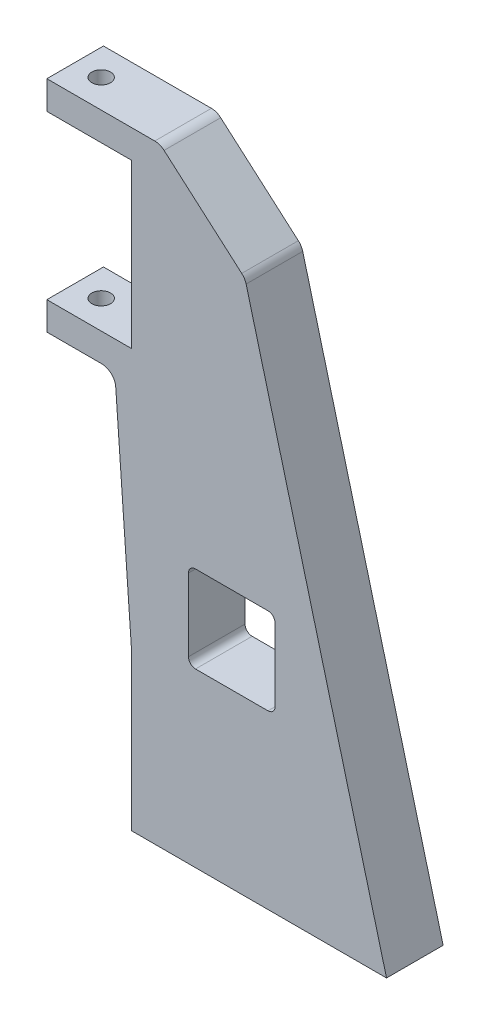
ISO-10303-21;
HEADER;
FILE_DESCRIPTION(('STEP AP214'),'2;1');
FILE_NAME('part.step','',(''),(''),'','','');
FILE_SCHEMA(('AUTOMOTIVE_DESIGN { 1 0 10303 214 1 1 1 1 }'));
ENDSEC;
DATA;
#1=APPLICATION_CONTEXT('core data for automotive mechanical design processes');
#2=APPLICATION_PROTOCOL_DEFINITION('international standard','automotive_design',2000,#1);
#3=PRODUCT_CONTEXT('',#1,'mechanical');
#4=PRODUCT('Part','Part','',(#3));
#5=PRODUCT_RELATED_PRODUCT_CATEGORY('part','',(#4));
#6=PRODUCT_DEFINITION_FORMATION('','',#4);
#7=PRODUCT_DEFINITION_CONTEXT('part definition',#1,'design');
#8=PRODUCT_DEFINITION('design','',#6,#7);
#9=PRODUCT_DEFINITION_SHAPE('','',#8);
#10=(LENGTH_UNIT() NAMED_UNIT(*) SI_UNIT(.MILLI.,.METRE.));
#11=(NAMED_UNIT(*) PLANE_ANGLE_UNIT() SI_UNIT($,.RADIAN.));
#12=(NAMED_UNIT(*) SI_UNIT($,.STERADIAN.) SOLID_ANGLE_UNIT());
#13=UNCERTAINTY_MEASURE_WITH_UNIT(LENGTH_MEASURE(1.E-05),#10,'distance_accuracy_value','');
#14=(GEOMETRIC_REPRESENTATION_CONTEXT(3) GLOBAL_UNCERTAINTY_ASSIGNED_CONTEXT((#13)) GLOBAL_UNIT_ASSIGNED_CONTEXT((#10,
#11,#12)) REPRESENTATION_CONTEXT('',''));
#15=CARTESIAN_POINT('',(0.,0.,0.));
#16=DIRECTION('',(0.,0.,1.));
#17=DIRECTION('',(1.,0.,0.));
#18=AXIS2_PLACEMENT_3D('',#15,#16,#17);
#19=CARTESIAN_POINT('',(0.,0.,25.4));
#20=DIRECTION('',(0.,1.,0.));
#21=DIRECTION('',(0.,0.,1.));
#22=AXIS2_PLACEMENT_3D('',#19,#20,#21);
#23=PLANE('',#22);
#24=CARTESIAN_POINT('',(11.684,0.,12.7));
#25=DIRECTION('',(0.,1.,0.));
#26=DIRECTION('',(0.,0.,1.));
#27=AXIS2_PLACEMENT_3D('',#24,#25,#26);
#28=CIRCLE('',#27,4.191);
#29=CARTESIAN_POINT('',(11.684,0.,16.891));
#30=VERTEX_POINT('',#29);
#31=EDGE_CURVE('E347',#30,#30,#28,.T.);
#32=ORIENTED_EDGE('',*,*,#31,.T.);
#33=EDGE_LOOP('',(#32));
#34=FACE_BOUND('',#33,.T.);
#35=DIRECTION('',(1.,0.,0.));
#36=VECTOR('',#35,1.);
#37=CARTESIAN_POINT('',(0.,0.,0.));
#38=LINE('',#37,#36);
#39=CARTESIAN_POINT('',(0.,0.,0.));
#40=VERTEX_POINT('',#39);
#41=CARTESIAN_POINT('',(38.0186594192209,0.,0.));
#42=VERTEX_POINT('',#41);
#43=EDGE_CURVE('E226',#40,#42,#38,.T.);
#44=ORIENTED_EDGE('',*,*,#43,.T.);
#45=DIRECTION('',(0.,0.,-1.));
#46=VECTOR('',#45,1.);
#47=CARTESIAN_POINT('',(38.0186594192209,0.,25.4));
#48=LINE('',#47,#46);
#49=CARTESIAN_POINT('',(38.0186594192209,0.,25.4));
#50=VERTEX_POINT('',#49);
#51=EDGE_CURVE('E204',#50,#42,#48,.T.);
#52=ORIENTED_EDGE('',*,*,#51,.F.);
#53=DIRECTION('',(1.,0.,0.));
#54=VECTOR('',#53,1.);
#55=CARTESIAN_POINT('',(0.,0.,25.4));
#56=LINE('',#55,#54);
#57=CARTESIAN_POINT('',(0.,0.,25.4));
#58=VERTEX_POINT('',#57);
#59=EDGE_CURVE('E212',#58,#50,#56,.T.);
#60=ORIENTED_EDGE('',*,*,#59,.F.);
#61=DIRECTION('',(0.,0.,-1.));
#62=VECTOR('',#61,1.);
#63=CARTESIAN_POINT('',(0.,0.,25.4));
#64=LINE('',#63,#62);
#65=EDGE_CURVE('E408',#58,#40,#64,.T.);
#66=ORIENTED_EDGE('',*,*,#65,.T.);
#67=EDGE_LOOP('',(#44,#52,#60,#66));
#68=FACE_BOUND('',#67,.T.);
#69=ADVANCED_FACE('F38',(#34,#68),#23,.F.);
#70=CARTESIAN_POINT('',(38.0186594192209,0.,25.4));
#71=DIRECTION('',(1.,0.,0.));
#72=DIRECTION('',(0.,0.,-1.));
#73=AXIS2_PLACEMENT_3D('',#70,#71,#72);
#74=PLANE('',#73);
#75=DIRECTION('',(0.,-1.,0.));
#76=VECTOR('',#75,1.);
#77=CARTESIAN_POINT('',(38.0186594192209,0.,0.));
#78=LINE('',#77,#76);
#79=CARTESIAN_POINT('',(38.0186594192209,-73.1522603664943,0.));
#80=VERTEX_POINT('',#79);
#81=EDGE_CURVE('E411',#42,#80,#78,.T.);
#82=ORIENTED_EDGE('',*,*,#81,.T.);
#83=DIRECTION('',(0.,0.,-1.));
#84=VECTOR('',#83,1.);
#85=CARTESIAN_POINT('',(38.0186594192209,-73.1522603664943,25.4));
#86=LINE('',#85,#84);
#87=CARTESIAN_POINT('',(38.0186594192209,-73.1522603664943,25.4));
#88=VERTEX_POINT('',#87);
#89=EDGE_CURVE('E207',#88,#80,#86,.T.);
#90=ORIENTED_EDGE('',*,*,#89,.F.);
#91=DIRECTION('',(0.,-1.,0.));
#92=VECTOR('',#91,1.);
#93=CARTESIAN_POINT('',(38.0186594192209,0.,25.4));
#94=LINE('',#93,#92);
#95=EDGE_CURVE('E200',#50,#88,#94,.T.);
#96=ORIENTED_EDGE('',*,*,#95,.F.);
#97=ORIENTED_EDGE('',*,*,#51,.T.);
#98=EDGE_LOOP('',(#82,#90,#96,#97));
#99=FACE_BOUND('',#98,.T.);
#100=ADVANCED_FACE('F202',(#99),#74,.F.);
#101=CARTESIAN_POINT('',(38.0186594192209,-73.1522603664943,25.4));
#102=DIRECTION('',(0.,-1.,0.));
#103=DIRECTION('',(0.,0.,-1.));
#104=AXIS2_PLACEMENT_3D('',#101,#102,#103);
#105=PLANE('',#104);
#106=CARTESIAN_POINT('',(11.684,-73.1522603664942,12.7));
#107=DIRECTION('',(0.,-1.,0.));
#108=DIRECTION('',(0.,0.,-1.));
#109=AXIS2_PLACEMENT_3D('',#106,#107,#108);
#110=CIRCLE('',#109,4.191);
#111=CARTESIAN_POINT('',(11.684,-73.1522603664942,8.509));
#112=VERTEX_POINT('',#111);
#113=EDGE_CURVE('E625',#112,#112,#110,.T.);
#114=ORIENTED_EDGE('',*,*,#113,.T.);
#115=EDGE_LOOP('',(#114));
#116=FACE_BOUND('',#115,.T.);
#117=DIRECTION('',(-1.,0.,0.));
#118=VECTOR('',#117,1.);
#119=CARTESIAN_POINT('',(38.0186594192209,-73.1522603664943,0.));
#120=LINE('',#119,#118);
#121=CARTESIAN_POINT('',(0.,-73.1522603664943,0.));
#122=VERTEX_POINT('',#121);
#123=EDGE_CURVE('E414',#80,#122,#120,.T.);
#124=ORIENTED_EDGE('',*,*,#123,.T.);
#125=DIRECTION('',(0.,0.,-1.));
#126=VECTOR('',#125,1.);
#127=CARTESIAN_POINT('',(0.,-73.1522603664943,25.4));
#128=LINE('',#127,#126);
#129=CARTESIAN_POINT('',(0.,-73.1522603664943,25.4));
#130=VERTEX_POINT('',#129);
#131=EDGE_CURVE('E235',#130,#122,#128,.T.);
#132=ORIENTED_EDGE('',*,*,#131,.F.);
#133=DIRECTION('',(-1.,0.,0.));
#134=VECTOR('',#133,1.);
#135=CARTESIAN_POINT('',(38.0186594192209,-73.1522603664943,25.4));
#136=LINE('',#135,#134);
#137=EDGE_CURVE('E211',#88,#130,#136,.T.);
#138=ORIENTED_EDGE('',*,*,#137,.F.);
#139=ORIENTED_EDGE('',*,*,#89,.T.);
#140=EDGE_LOOP('',(#124,#132,#138,#139));
#141=FACE_BOUND('',#140,.T.);
#142=ADVANCED_FACE('F527',(#116,#141),#105,.F.);
#143=CARTESIAN_POINT('',(0.,-73.1522603664943,25.4));
#144=DIRECTION('',(1.,0.,0.));
#145=DIRECTION('',(0.,0.,-1.));
#146=AXIS2_PLACEMENT_3D('',#143,#144,#145);
#147=PLANE('',#146);
#148=DIRECTION('',(0.,-1.,0.));
#149=VECTOR('',#148,1.);
#150=CARTESIAN_POINT('',(0.,-73.1522603664943,0.));
#151=LINE('',#150,#149);
#152=CARTESIAN_POINT('',(0.,-85.7639267927339,0.));
#153=VERTEX_POINT('',#152);
#154=EDGE_CURVE('E417',#122,#153,#151,.T.);
#155=ORIENTED_EDGE('',*,*,#154,.T.);
#156=DIRECTION('',(0.,0.,-1.));
#157=VECTOR('',#156,1.);
#158=CARTESIAN_POINT('',(0.,-85.7639267927339,25.4));
#159=LINE('',#158,#157);
#160=CARTESIAN_POINT('',(0.,-85.7639267927339,25.4));
#161=VERTEX_POINT('',#160);
#162=EDGE_CURVE('E461',#161,#153,#159,.T.);
#163=ORIENTED_EDGE('',*,*,#162,.F.);
#164=DIRECTION('',(0.,-1.,0.));
#165=VECTOR('',#164,1.);
#166=CARTESIAN_POINT('',(0.,-73.1522603664943,25.4));
#167=LINE('',#166,#165);
#168=EDGE_CURVE('E379',#130,#161,#167,.T.);
#169=ORIENTED_EDGE('',*,*,#168,.F.);
#170=ORIENTED_EDGE('',*,*,#131,.T.);
#171=EDGE_LOOP('',(#155,#163,#169,#170));
#172=FACE_BOUND('',#171,.T.);
#173=ADVANCED_FACE('F470',(#172),#147,.F.);
#174=CARTESIAN_POINT('',(0.,-85.7639267927339,25.4));
#175=DIRECTION('',(0.,1.,0.));
#176=DIRECTION('',(0.,0.,1.));
#177=AXIS2_PLACEMENT_3D('',#174,#175,#176);
#178=PLANE('',#177);
#179=CARTESIAN_POINT('',(11.684,-85.7639267927339,12.7));
#180=DIRECTION('',(0.,1.,0.));
#181=DIRECTION('',(0.,0.,1.));
#182=AXIS2_PLACEMENT_3D('',#179,#180,#181);
#183=CIRCLE('',#182,4.191);
#184=CARTESIAN_POINT('',(11.684,-85.7639267927339,16.891));
#185=VERTEX_POINT('',#184);
#186=EDGE_CURVE('E622',#185,#185,#183,.T.);
#187=ORIENTED_EDGE('',*,*,#186,.T.);
#188=EDGE_LOOP('',(#187));
#189=FACE_BOUND('',#188,.T.);
#190=DIRECTION('',(1.,0.,0.));
#191=VECTOR('',#190,1.);
#192=CARTESIAN_POINT('',(0.,-85.7639267927339,0.));
#193=LINE('',#192,#191);
#194=CARTESIAN_POINT('',(24.5698359864801,-85.7639267927339,0.));
#195=VERTEX_POINT('',#194);
#196=EDGE_CURVE('E420',#153,#195,#193,.T.);
#197=ORIENTED_EDGE('',*,*,#196,.T.);
#198=DIRECTION('',(0.,0.,-1.));
#199=VECTOR('',#198,1.);
#200=CARTESIAN_POINT('',(24.5698359864801,-85.7639267927339,25.4));
#201=LINE('',#200,#199);
#202=CARTESIAN_POINT('',(24.5698359864801,-85.7639267927339,25.4));
#203=VERTEX_POINT('',#202);
#204=EDGE_CURVE('E245',#195,#203,#201,.F.);
#205=ORIENTED_EDGE('',*,*,#204,.T.);
#206=DIRECTION('',(1.,0.,0.));
#207=VECTOR('',#206,1.);
#208=CARTESIAN_POINT('',(0.,-85.7639267927339,25.4));
#209=LINE('',#208,#207);
#210=EDGE_CURVE('E382',#161,#203,#209,.T.);
#211=ORIENTED_EDGE('',*,*,#210,.F.);
#212=ORIENTED_EDGE('',*,*,#162,.T.);
#213=EDGE_LOOP('',(#197,#205,#211,#212));
#214=FACE_BOUND('',#213,.T.);
#215=ADVANCED_FACE('F479',(#189,#214),#178,.F.);
#216=CARTESIAN_POINT('',(30.48,-85.7639267927339,25.4));
#217=DIRECTION('',(0.997429246927339,0.071658198232729,0.));
#218=DIRECTION('',(-0.071658198232729,0.997429246927339,0.));
#219=AXIS2_PLACEMENT_3D('',#216,#217,#218);
#220=PLANE('',#219);
#221=DIRECTION('',(0.071658198232729,-0.997429246927339,0.));
#222=VECTOR('',#221,1.);
#223=CARTESIAN_POINT('',(30.48,-85.7639267927339,0.));
#224=LINE('',#223,#222);
#225=CARTESIAN_POINT('',(30.9035117044687,-91.6588972339561,0.));
#226=VERTEX_POINT('',#225);
#227=CARTESIAN_POINT('',(38.0023351372095,-190.469281603275,0.));
#228=VERTEX_POINT('',#227);
#229=EDGE_CURVE('E424',#226,#228,#224,.T.);
#230=ORIENTED_EDGE('',*,*,#229,.T.);
#231=DIRECTION('',(0.,0.,-1.));
#232=VECTOR('',#231,1.);
#233=CARTESIAN_POINT('',(38.0023351372095,-190.469281603275,25.4));
#234=LINE('',#233,#232);
#235=CARTESIAN_POINT('',(38.0023351372095,-190.469281603275,25.4));
#236=VERTEX_POINT('',#235);
#237=EDGE_CURVE('E242',#228,#236,#234,.F.);
#238=ORIENTED_EDGE('',*,*,#237,.T.);
#239=DIRECTION('',(0.071658198232729,-0.997429246927339,0.));
#240=VECTOR('',#239,1.);
#241=CARTESIAN_POINT('',(30.48,-85.7639267927339,25.4));
#242=LINE('',#241,#240);
#243=CARTESIAN_POINT('',(30.9035117044687,-91.6588972339561,25.4));
#244=VERTEX_POINT('',#243);
#245=EDGE_CURVE('E386',#244,#236,#242,.T.);
#246=ORIENTED_EDGE('',*,*,#245,.F.);
#247=DIRECTION('',(0.,0.,-1.));
#248=VECTOR('',#247,1.);
#249=CARTESIAN_POINT('',(30.9035117044687,-91.6588972339561,0.));
#250=LINE('',#249,#248);
#251=EDGE_CURVE('E233',#244,#226,#250,.T.);
#252=ORIENTED_EDGE('',*,*,#251,.T.);
#253=EDGE_LOOP('',(#230,#238,#246,#252));
#254=FACE_BOUND('',#253,.T.);
#255=ADVANCED_FACE('F488',(#254),#220,.F.);
#256=CARTESIAN_POINT('',(38.0186594192209,-190.696503564123,25.4));
#257=DIRECTION('',(1.,0.,0.));
#258=DIRECTION('',(0.,0.,-1.));
#259=AXIS2_PLACEMENT_3D('',#256,#257,#258);
#260=PLANE('',#259);
#261=DIRECTION('',(0.,-1.,0.));
#262=VECTOR('',#261,1.);
#263=CARTESIAN_POINT('',(38.0186594192209,-190.696503564123,25.4));
#264=LINE('',#263,#262);
#265=CARTESIAN_POINT('',(38.0186594192209,-190.924311162053,25.4));
#266=VERTEX_POINT('',#265);
#267=CARTESIAN_POINT('',(38.0186594192209,-260.515926792734,25.4));
#268=VERTEX_POINT('',#267);
#269=EDGE_CURVE('E390',#266,#268,#264,.T.);
#270=ORIENTED_EDGE('',*,*,#269,.F.);
#271=DIRECTION('',(0.,0.,-1.));
#272=VECTOR('',#271,1.);
#273=CARTESIAN_POINT('',(38.0186594192209,-190.924311162053,0.));
#274=LINE('',#273,#272);
#275=CARTESIAN_POINT('',(38.0186594192209,-190.924311162053,0.));
#276=VERTEX_POINT('',#275);
#277=EDGE_CURVE('E228',#266,#276,#274,.T.);
#278=ORIENTED_EDGE('',*,*,#277,.T.);
#279=DIRECTION('',(0.,-1.,0.));
#280=VECTOR('',#279,1.);
#281=CARTESIAN_POINT('',(38.0186594192209,-190.696503564123,0.));
#282=LINE('',#281,#280);
#283=CARTESIAN_POINT('',(38.0186594192209,-260.515926792734,0.));
#284=VERTEX_POINT('',#283);
#285=EDGE_CURVE('E428',#276,#284,#282,.T.);
#286=ORIENTED_EDGE('',*,*,#285,.T.);
#287=DIRECTION('',(0.,0.,-1.));
#288=VECTOR('',#287,1.);
#289=CARTESIAN_POINT('',(38.0186594192209,-260.515926792734,25.4));
#290=LINE('',#289,#288);
#291=EDGE_CURVE('E457',#268,#284,#290,.T.);
#292=ORIENTED_EDGE('',*,*,#291,.F.);
#293=EDGE_LOOP('',(#270,#278,#286,#292));
#294=FACE_BOUND('',#293,.T.);
#295=ADVANCED_FACE('F496',(#294),#260,.F.);
#296=CARTESIAN_POINT('',(38.0186594192209,-260.515926792734,25.4));
#297=DIRECTION('',(0.,1.,0.));
#298=DIRECTION('',(-1.,0.,0.));
#299=AXIS2_PLACEMENT_3D('',#296,#297,#298);
#300=PLANE('',#299);
#301=CARTESIAN_POINT('',(139.7,-260.515926792734,12.7));
#302=DIRECTION('',(0.,-1.,0.));
#303=DIRECTION('',(1.,0.,0.));
#304=AXIS2_PLACEMENT_3D('',#301,#302,#303);
#305=CIRCLE('',#304,4.191);
#306=CARTESIAN_POINT('',(143.891,-260.515926792734,12.7));
#307=VERTEX_POINT('',#306);
#308=EDGE_CURVE('E673',#307,#307,#305,.T.);
#309=ORIENTED_EDGE('',*,*,#308,.F.);
#310=EDGE_LOOP('',(#309));
#311=FACE_BOUND('',#310,.T.);
#312=CARTESIAN_POINT('',(63.5,-260.515926792734,12.7));
#313=DIRECTION('',(0.,-1.,0.));
#314=DIRECTION('',(1.,0.,0.));
#315=AXIS2_PLACEMENT_3D('',#312,#313,#314);
#316=CIRCLE('',#315,4.191);
#317=CARTESIAN_POINT('',(67.691,-260.515926792734,12.7));
#318=VERTEX_POINT('',#317);
#319=EDGE_CURVE('E682',#318,#318,#316,.T.);
#320=ORIENTED_EDGE('',*,*,#319,.F.);
#321=EDGE_LOOP('',(#320));
#322=FACE_BOUND('',#321,.T.);
#323=DIRECTION('',(1.,0.,0.));
#324=VECTOR('',#323,1.);
#325=CARTESIAN_POINT('',(38.0186594192209,-260.515926792734,0.));
#326=LINE('',#325,#324);
#327=CARTESIAN_POINT('',(152.4,-260.515926792734,0.));
#328=VERTEX_POINT('',#327);
#329=EDGE_CURVE('E431',#284,#328,#326,.T.);
#330=ORIENTED_EDGE('',*,*,#329,.T.);
#331=DIRECTION('',(0.,0.,-1.));
#332=VECTOR('',#331,1.);
#333=CARTESIAN_POINT('',(152.4,-260.515926792734,25.4));
#334=LINE('',#333,#332);
#335=CARTESIAN_POINT('',(152.4,-260.515926792734,25.4));
#336=VERTEX_POINT('',#335);
#337=EDGE_CURVE('E453',#336,#328,#334,.T.);
#338=ORIENTED_EDGE('',*,*,#337,.F.);
#339=DIRECTION('',(1.,0.,0.));
#340=VECTOR('',#339,1.);
#341=CARTESIAN_POINT('',(38.0186594192209,-260.515926792734,25.4));
#342=LINE('',#341,#340);
#343=EDGE_CURVE('E393',#268,#336,#342,.T.);
#344=ORIENTED_EDGE('',*,*,#343,.F.);
#345=ORIENTED_EDGE('',*,*,#291,.T.);
#346=EDGE_LOOP('',(#330,#338,#344,#345));
#347=FACE_BOUND('',#346,.T.);
#348=ADVANCED_FACE('F502',(#311,#322,#347),#300,.F.);
#349=CARTESIAN_POINT('',(152.4,-260.515926792734,25.4));
#350=DIRECTION('',(-0.966736029953068,-0.255776168535266,0.));
#351=DIRECTION('',(0.255776168535266,-0.966736029953068,0.));
#352=AXIS2_PLACEMENT_3D('',#349,#350,#351);
#353=PLANE('',#352);
#354=DIRECTION('',(-0.255776168535266,0.966736029953068,0.));
#355=VECTOR('',#354,1.);
#356=CARTESIAN_POINT('',(152.4,-260.515926792734,0.));
#357=LINE('',#356,#355);
#358=CARTESIAN_POINT('',(89.3981591637287,-22.3930796229651,0.));
#359=VERTEX_POINT('',#358);
#360=EDGE_CURVE('E434',#328,#359,#357,.T.);
#361=ORIENTED_EDGE('',*,*,#360,.T.);
#362=DIRECTION('',(0.,0.,-1.));
#363=VECTOR('',#362,1.);
#364=CARTESIAN_POINT('',(89.3981591637287,-22.393079622965,25.4));
#365=LINE('',#364,#363);
#366=CARTESIAN_POINT('',(89.3981591637287,-22.3930796229651,25.4));
#367=VERTEX_POINT('',#366);
#368=EDGE_CURVE('E261',#359,#367,#365,.F.);
#369=ORIENTED_EDGE('',*,*,#368,.T.);
#370=DIRECTION('',(-0.255776168535266,0.966736029953068,0.));
#371=VECTOR('',#370,1.);
#372=CARTESIAN_POINT('',(152.4,-260.515926792734,25.4));
#373=LINE('',#372,#371);
#374=EDGE_CURVE('E396',#336,#367,#373,.T.);
#375=ORIENTED_EDGE('',*,*,#374,.F.);
#376=ORIENTED_EDGE('',*,*,#337,.T.);
#377=EDGE_LOOP('',(#361,#369,#375,#376));
#378=FACE_BOUND('',#377,.T.);
#379=ADVANCED_FACE('F607',(#378),#353,.F.);
#380=CARTESIAN_POINT('',(50.8,12.7,25.4));
#381=DIRECTION('',(-0.657077237358178,-0.753823257896534,0.));
#382=DIRECTION('',(0.753823257896534,-0.657077237358178,0.));
#383=AXIS2_PLACEMENT_3D('',#380,#381,#382);
#384=PLANE('',#383);
#385=DIRECTION('',(-0.753823257896534,0.657077237358178,0.));
#386=VECTOR('',#385,1.);
#387=CARTESIAN_POINT('',(50.8,12.7,25.4));
#388=LINE('',#387,#386);
#389=CARTESIAN_POINT('',(87.4318258307511,-19.230480605521,25.4));
#390=VERTEX_POINT('',#389);
#391=CARTESIAN_POINT('',(52.5933863316515,11.136777687643,25.4));
#392=VERTEX_POINT('',#391);
#393=EDGE_CURVE('E399',#390,#392,#388,.T.);
#394=ORIENTED_EDGE('',*,*,#393,.F.);
#395=DIRECTION('',(0.,0.,-1.));
#396=VECTOR('',#395,1.);
#397=CARTESIAN_POINT('',(87.4318258307511,-19.230480605521,25.4));
#398=LINE('',#397,#396);
#399=CARTESIAN_POINT('',(87.4318258307511,-19.230480605521,0.));
#400=VERTEX_POINT('',#399);
#401=EDGE_CURVE('E251',#390,#400,#398,.T.);
#402=ORIENTED_EDGE('',*,*,#401,.T.);
#403=DIRECTION('',(-0.753823257896534,0.657077237358178,0.));
#404=VECTOR('',#403,1.);
#405=CARTESIAN_POINT('',(50.8,12.7,0.));
#406=LINE('',#405,#404);
#407=CARTESIAN_POINT('',(52.5933863316515,11.136777687643,0.));
#408=VERTEX_POINT('',#407);
#409=EDGE_CURVE('E438',#400,#408,#406,.T.);
#410=ORIENTED_EDGE('',*,*,#409,.T.);
#411=DIRECTION('',(0.,0.,-1.));
#412=VECTOR('',#411,1.);
#413=CARTESIAN_POINT('',(52.5933863316515,11.136777687643,25.4));
#414=LINE('',#413,#412);
#415=EDGE_CURVE('E248',#408,#392,#414,.F.);
#416=ORIENTED_EDGE('',*,*,#415,.T.);
#417=EDGE_LOOP('',(#394,#402,#410,#416));
#418=FACE_BOUND('',#417,.T.);
#419=ADVANCED_FACE('F512',(#418),#384,.F.);
#420=CARTESIAN_POINT('',(0.,12.7,25.4));
#421=DIRECTION('',(0.,-1.,0.));
#422=DIRECTION('',(0.,0.,-1.));
#423=AXIS2_PLACEMENT_3D('',#420,#421,#422);
#424=PLANE('',#423);
#425=CARTESIAN_POINT('',(11.684,12.7,12.7));
#426=DIRECTION('',(0.,1.,0.));
#427=DIRECTION('',(0.,0.,1.));
#428=AXIS2_PLACEMENT_3D('',#425,#426,#427);
#429=CIRCLE('',#428,4.191);
#430=CARTESIAN_POINT('',(11.684,12.7,16.891));
#431=VERTEX_POINT('',#430);
#432=EDGE_CURVE('E626',#431,#431,#429,.T.);
#433=ORIENTED_EDGE('',*,*,#432,.F.);
#434=EDGE_LOOP('',(#433));
#435=FACE_BOUND('',#434,.T.);
#436=DIRECTION('',(-1.,0.,0.));
#437=VECTOR('',#436,1.);
#438=CARTESIAN_POINT('',(0.,12.7,25.4));
#439=LINE('',#438,#437);
#440=CARTESIAN_POINT('',(48.4209458744271,12.7,25.4));
#441=VERTEX_POINT('',#440);
#442=CARTESIAN_POINT('',(0.,12.7,25.4));
#443=VERTEX_POINT('',#442);
#444=EDGE_CURVE('E403',#441,#443,#439,.T.);
#445=ORIENTED_EDGE('',*,*,#444,.F.);
#446=DIRECTION('',(0.,0.,-1.));
#447=VECTOR('',#446,1.);
#448=CARTESIAN_POINT('',(48.4209458744271,12.7,25.4));
#449=LINE('',#448,#447);
#450=CARTESIAN_POINT('',(48.4209458744271,12.7,0.));
#451=VERTEX_POINT('',#450);
#452=EDGE_CURVE('E270',#441,#451,#449,.T.);
#453=ORIENTED_EDGE('',*,*,#452,.T.);
#454=DIRECTION('',(-1.,0.,0.));
#455=VECTOR('',#454,1.);
#456=CARTESIAN_POINT('',(0.,12.7,0.));
#457=LINE('',#456,#455);
#458=CARTESIAN_POINT('',(0.,12.7,0.));
#459=VERTEX_POINT('',#458);
#460=EDGE_CURVE('E442',#451,#459,#457,.T.);
#461=ORIENTED_EDGE('',*,*,#460,.T.);
#462=DIRECTION('',(0.,0.,-1.));
#463=VECTOR('',#462,1.);
#464=CARTESIAN_POINT('',(0.,12.7,25.4));
#465=LINE('',#464,#463);
#466=EDGE_CURVE('E449',#443,#459,#465,.T.);
#467=ORIENTED_EDGE('',*,*,#466,.F.);
#468=EDGE_LOOP('',(#445,#453,#461,#467));
#469=FACE_BOUND('',#468,.T.);
#470=ADVANCED_FACE('F523',(#435,#469),#424,.F.);
#471=CARTESIAN_POINT('',(0.,0.,25.4));
#472=DIRECTION('',(1.,0.,0.));
#473=DIRECTION('',(0.,0.,-1.));
#474=AXIS2_PLACEMENT_3D('',#471,#472,#473);
#475=PLANE('',#474);
#476=DIRECTION('',(0.,-1.,0.));
#477=VECTOR('',#476,1.);
#478=CARTESIAN_POINT('',(0.,0.,0.));
#479=LINE('',#478,#477);
#480=EDGE_CURVE('E223',#459,#40,#479,.T.);
#481=ORIENTED_EDGE('',*,*,#480,.T.);
#482=ORIENTED_EDGE('',*,*,#65,.F.);
#483=DIRECTION('',(0.,-1.,0.));
#484=VECTOR('',#483,1.);
#485=CARTESIAN_POINT('',(0.,0.,25.4));
#486=LINE('',#485,#484);
#487=EDGE_CURVE('E218',#443,#58,#486,.T.);
#488=ORIENTED_EDGE('',*,*,#487,.F.);
#489=ORIENTED_EDGE('',*,*,#466,.T.);
#490=EDGE_LOOP('',(#481,#482,#488,#489));
#491=FACE_BOUND('',#490,.T.);
#492=ADVANCED_FACE('F526',(#491),#475,.F.);
#493=CARTESIAN_POINT('',(0.,0.,25.4));
#494=DIRECTION('',(0.,0.,-1.));
#495=DIRECTION('',(-1.,0.,0.));
#496=AXIS2_PLACEMENT_3D('',#493,#494,#495);
#497=PLANE('',#496);
#498=DIRECTION('',(0.,-1.,0.));
#499=VECTOR('',#498,1.);
#500=CARTESIAN_POINT('',(102.386564703997,-183.299926792734,25.4));
#501=LINE('',#500,#499);
#502=CARTESIAN_POINT('',(102.386564703997,-147.612926792734,25.4));
#503=VERTEX_POINT('',#502);
#504=CARTESIAN_POINT('',(102.386564703997,-180.124926792734,25.4));
#505=VERTEX_POINT('',#504);
#506=EDGE_CURVE('E353',#503,#505,#501,.T.);
#507=ORIENTED_EDGE('',*,*,#506,.T.);
#508=CARTESIAN_POINT('',(99.2115647039966,-180.124926792734,25.4));
#509=DIRECTION('',(0.,0.,-1.));
#510=DIRECTION('',(-1.,0.,0.));
#511=AXIS2_PLACEMENT_3D('',#508,#509,#510);
#512=CIRCLE('',#511,3.175);
#513=CARTESIAN_POINT('',(99.2115647039966,-183.299926792734,25.4));
#514=VERTEX_POINT('',#513);
#515=EDGE_CURVE('E322',#505,#514,#512,.T.);
#516=ORIENTED_EDGE('',*,*,#515,.T.);
#517=DIRECTION('',(-1.,0.,0.));
#518=VECTOR('',#517,1.);
#519=CARTESIAN_POINT('',(63.5245647039966,-183.299926792734,25.4));
#520=LINE('',#519,#518);
#521=CARTESIAN_POINT('',(66.6995647039966,-183.299926792734,25.4));
#522=VERTEX_POINT('',#521);
#523=EDGE_CURVE('E359',#514,#522,#520,.T.);
#524=ORIENTED_EDGE('',*,*,#523,.T.);
#525=CARTESIAN_POINT('',(66.6995647039966,-180.124926792734,25.4));
#526=DIRECTION('',(0.,0.,-1.));
#527=DIRECTION('',(-1.,0.,0.));
#528=AXIS2_PLACEMENT_3D('',#525,#526,#527);
#529=CIRCLE('',#528,3.175);
#530=CARTESIAN_POINT('',(63.5245647039966,-180.124926792734,25.4));
#531=VERTEX_POINT('',#530);
#532=EDGE_CURVE('E316',#522,#531,#529,.T.);
#533=ORIENTED_EDGE('',*,*,#532,.T.);
#534=DIRECTION('',(0.,1.,0.));
#535=VECTOR('',#534,1.);
#536=CARTESIAN_POINT('',(63.5245647039966,-183.299926792734,25.4));
#537=LINE('',#536,#535);
#538=CARTESIAN_POINT('',(63.5245647039966,-147.612926792734,25.4));
#539=VERTEX_POINT('',#538);
#540=EDGE_CURVE('E354',#531,#539,#537,.T.);
#541=ORIENTED_EDGE('',*,*,#540,.T.);
#542=CARTESIAN_POINT('',(66.6995647039966,-147.612926792734,25.4));
#543=DIRECTION('',(0.,0.,-1.));
#544=DIRECTION('',(-1.,0.,0.));
#545=AXIS2_PLACEMENT_3D('',#542,#543,#544);
#546=CIRCLE('',#545,3.175);
#547=CARTESIAN_POINT('',(66.6995647039966,-144.437926792734,25.4));
#548=VERTEX_POINT('',#547);
#549=EDGE_CURVE('E11',#539,#548,#546,.T.);
#550=ORIENTED_EDGE('',*,*,#549,.T.);
#551=DIRECTION('',(1.,0.,0.));
#552=VECTOR('',#551,1.);
#553=CARTESIAN_POINT('',(63.5245647039966,-144.437926792734,25.4));
#554=LINE('',#553,#552);
#555=CARTESIAN_POINT('',(99.2115647039966,-144.437926792734,25.4));
#556=VERTEX_POINT('',#555);
#557=EDGE_CURVE('E350',#548,#556,#554,.T.);
#558=ORIENTED_EDGE('',*,*,#557,.T.);
#559=CARTESIAN_POINT('',(99.2115647039966,-147.612926792734,25.4));
#560=DIRECTION('',(0.,0.,-1.));
#561=DIRECTION('',(-1.,0.,0.));
#562=AXIS2_PLACEMENT_3D('',#559,#560,#561);
#563=CIRCLE('',#562,3.175);
#564=EDGE_CURVE('E328',#556,#503,#563,.T.);
#565=ORIENTED_EDGE('',*,*,#564,.T.);
#566=EDGE_LOOP('',(#507,#516,#524,#533,#541,#550,#558,#565));
#567=FACE_BOUND('',#566,.T.);
#568=ORIENTED_EDGE('',*,*,#374,.T.);
#569=CARTESIAN_POINT('',(83.2593853735267,-24.017258293164,25.4));
#570=DIRECTION('',(0.,0.,-1.));
#571=DIRECTION('',(-1.,0.,0.));
#572=AXIS2_PLACEMENT_3D('',#569,#570,#571);
#573=CIRCLE('',#572,6.35);
#574=EDGE_CURVE('E267',#367,#390,#573,.F.);
#575=ORIENTED_EDGE('',*,*,#574,.T.);
#576=ORIENTED_EDGE('',*,*,#393,.T.);
#577=CARTESIAN_POINT('',(48.4209458744271,6.35,25.4));
#578=DIRECTION('',(0.,0.,-1.));
#579=DIRECTION('',(-1.,0.,0.));
#580=AXIS2_PLACEMENT_3D('',#577,#578,#579);
#581=CIRCLE('',#580,6.35);
#582=EDGE_CURVE('E264',#392,#441,#581,.F.);
#583=ORIENTED_EDGE('',*,*,#582,.T.);
#584=ORIENTED_EDGE('',*,*,#444,.T.);
#585=ORIENTED_EDGE('',*,*,#487,.T.);
#586=ORIENTED_EDGE('',*,*,#59,.T.);
#587=ORIENTED_EDGE('',*,*,#95,.T.);
#588=ORIENTED_EDGE('',*,*,#137,.T.);
#589=ORIENTED_EDGE('',*,*,#168,.T.);
#590=ORIENTED_EDGE('',*,*,#210,.T.);
#591=CARTESIAN_POINT('',(24.5698359864801,-92.1139267927339,25.4));
#592=DIRECTION('',(0.,0.,-1.));
#593=DIRECTION('',(-1.,0.,0.));
#594=AXIS2_PLACEMENT_3D('',#591,#592,#593);
#595=CIRCLE('',#594,6.35);
#596=EDGE_CURVE('E283',#203,#244,#595,.T.);
#597=ORIENTED_EDGE('',*,*,#596,.T.);
#598=ORIENTED_EDGE('',*,*,#245,.T.);
#599=CARTESIAN_POINT('',(31.6686594192209,-190.924311162053,25.4));
#600=DIRECTION('',(0.,0.,-1.));
#601=DIRECTION('',(-1.,0.,0.));
#602=AXIS2_PLACEMENT_3D('',#599,#600,#601);
#603=CIRCLE('',#602,6.35);
#604=EDGE_CURVE('E277',#236,#266,#603,.T.);
#605=ORIENTED_EDGE('',*,*,#604,.T.);
#606=ORIENTED_EDGE('',*,*,#269,.T.);
#607=ORIENTED_EDGE('',*,*,#343,.T.);
#608=EDGE_LOOP('',(#568,#575,#576,#583,#584,#585,#586,#587,#588,#589,#590,#597,#598,#605,#606,#607));
#609=FACE_BOUND('',#608,.T.);
#610=ADVANCED_FACE('F216',(#567,#609),#497,.F.);
#611=CARTESIAN_POINT('',(0.,0.,0.));
#612=DIRECTION('',(0.,0.,-1.));
#613=DIRECTION('',(-1.,0.,0.));
#614=AXIS2_PLACEMENT_3D('',#611,#612,#613);
#615=PLANE('',#614);
#616=DIRECTION('',(0.,1.,0.));
#617=VECTOR('',#616,1.);
#618=CARTESIAN_POINT('',(63.5245647039966,-183.299926792734,0.));
#619=LINE('',#618,#617);
#620=CARTESIAN_POINT('',(63.5245647039966,-180.124926792734,0.));
#621=VERTEX_POINT('',#620);
#622=CARTESIAN_POINT('',(63.5245647039966,-147.612926792734,0.));
#623=VERTEX_POINT('',#622);
#624=EDGE_CURVE('E337',#621,#623,#619,.T.);
#625=ORIENTED_EDGE('',*,*,#624,.F.);
#626=CARTESIAN_POINT('',(66.6995647039966,-180.124926792734,0.));
#627=DIRECTION('',(0.,0.,-1.));
#628=DIRECTION('',(-1.,0.,0.));
#629=AXIS2_PLACEMENT_3D('',#626,#627,#628);
#630=CIRCLE('',#629,3.175);
#631=CARTESIAN_POINT('',(66.6995647039966,-183.299926792734,0.));
#632=VERTEX_POINT('',#631);
#633=EDGE_CURVE('E313',#621,#632,#630,.F.);
#634=ORIENTED_EDGE('',*,*,#633,.T.);
#635=DIRECTION('',(-1.,0.,0.));
#636=VECTOR('',#635,1.);
#637=CARTESIAN_POINT('',(63.5245647039966,-183.299926792734,0.));
#638=LINE('',#637,#636);
#639=CARTESIAN_POINT('',(99.2115647039966,-183.299926792734,0.));
#640=VERTEX_POINT('',#639);
#641=EDGE_CURVE('E361',#640,#632,#638,.T.);
#642=ORIENTED_EDGE('',*,*,#641,.F.);
#643=CARTESIAN_POINT('',(99.2115647039966,-180.124926792734,0.));
#644=DIRECTION('',(0.,0.,-1.));
#645=DIRECTION('',(-1.,0.,0.));
#646=AXIS2_PLACEMENT_3D('',#643,#644,#645);
#647=CIRCLE('',#646,3.175);
#648=CARTESIAN_POINT('',(102.386564703997,-180.124926792734,0.));
#649=VERTEX_POINT('',#648);
#650=EDGE_CURVE('E319',#640,#649,#647,.F.);
#651=ORIENTED_EDGE('',*,*,#650,.T.);
#652=DIRECTION('',(0.,-1.,0.));
#653=VECTOR('',#652,1.);
#654=CARTESIAN_POINT('',(102.386564703997,-183.299926792734,0.));
#655=LINE('',#654,#653);
#656=CARTESIAN_POINT('',(102.386564703997,-147.612926792734,0.));
#657=VERTEX_POINT('',#656);
#658=EDGE_CURVE('E370',#657,#649,#655,.T.);
#659=ORIENTED_EDGE('',*,*,#658,.F.);
#660=CARTESIAN_POINT('',(99.2115647039966,-147.612926792734,0.));
#661=DIRECTION('',(0.,0.,-1.));
#662=DIRECTION('',(-1.,0.,0.));
#663=AXIS2_PLACEMENT_3D('',#660,#661,#662);
#664=CIRCLE('',#663,3.175);
#665=CARTESIAN_POINT('',(99.2115647039966,-144.437926792734,0.));
#666=VERTEX_POINT('',#665);
#667=EDGE_CURVE('E325',#657,#666,#664,.F.);
#668=ORIENTED_EDGE('',*,*,#667,.T.);
#669=DIRECTION('',(1.,0.,0.));
#670=VECTOR('',#669,1.);
#671=CARTESIAN_POINT('',(63.5245647039966,-144.437926792734,0.));
#672=LINE('',#671,#670);
#673=CARTESIAN_POINT('',(66.6995647039966,-144.437926792734,0.));
#674=VERTEX_POINT('',#673);
#675=EDGE_CURVE('E338',#674,#666,#672,.T.);
#676=ORIENTED_EDGE('',*,*,#675,.F.);
#677=CARTESIAN_POINT('',(66.6995647039966,-147.612926792734,0.));
#678=DIRECTION('',(0.,0.,-1.));
#679=DIRECTION('',(-1.,0.,0.));
#680=AXIS2_PLACEMENT_3D('',#677,#678,#679);
#681=CIRCLE('',#680,3.175);
#682=EDGE_CURVE('E47',#674,#623,#681,.F.);
#683=ORIENTED_EDGE('',*,*,#682,.T.);
#684=EDGE_LOOP('',(#625,#634,#642,#651,#659,#668,#676,#683));
#685=FACE_BOUND('',#684,.T.);
#686=ORIENTED_EDGE('',*,*,#409,.F.);
#687=CARTESIAN_POINT('',(83.2593853735267,-24.017258293164,0.));
#688=DIRECTION('',(0.,0.,-1.));
#689=DIRECTION('',(-1.,0.,0.));
#690=AXIS2_PLACEMENT_3D('',#687,#688,#689);
#691=CIRCLE('',#690,6.35);
#692=EDGE_CURVE('E258',#400,#359,#691,.T.);
#693=ORIENTED_EDGE('',*,*,#692,.T.);
#694=ORIENTED_EDGE('',*,*,#360,.F.);
#695=ORIENTED_EDGE('',*,*,#329,.F.);
#696=ORIENTED_EDGE('',*,*,#285,.F.);
#697=CARTESIAN_POINT('',(31.6686594192209,-190.924311162053,0.));
#698=DIRECTION('',(0.,0.,-1.));
#699=DIRECTION('',(-1.,0.,0.));
#700=AXIS2_PLACEMENT_3D('',#697,#698,#699);
#701=CIRCLE('',#700,6.35);
#702=EDGE_CURVE('E274',#276,#228,#701,.F.);
#703=ORIENTED_EDGE('',*,*,#702,.T.);
#704=ORIENTED_EDGE('',*,*,#229,.F.);
#705=CARTESIAN_POINT('',(24.5698359864801,-92.1139267927339,0.));
#706=DIRECTION('',(0.,0.,-1.));
#707=DIRECTION('',(-1.,0.,0.));
#708=AXIS2_PLACEMENT_3D('',#705,#706,#707);
#709=CIRCLE('',#708,6.35);
#710=EDGE_CURVE('E280',#226,#195,#709,.F.);
#711=ORIENTED_EDGE('',*,*,#710,.T.);
#712=ORIENTED_EDGE('',*,*,#196,.F.);
#713=ORIENTED_EDGE('',*,*,#154,.F.);
#714=ORIENTED_EDGE('',*,*,#123,.F.);
#715=ORIENTED_EDGE('',*,*,#81,.F.);
#716=ORIENTED_EDGE('',*,*,#43,.F.);
#717=ORIENTED_EDGE('',*,*,#480,.F.);
#718=ORIENTED_EDGE('',*,*,#460,.F.);
#719=CARTESIAN_POINT('',(48.4209458744271,6.35,0.));
#720=DIRECTION('',(0.,0.,-1.));
#721=DIRECTION('',(-1.,0.,0.));
#722=AXIS2_PLACEMENT_3D('',#719,#720,#721);
#723=CIRCLE('',#722,6.35);
#724=EDGE_CURVE('E255',#451,#408,#723,.T.);
#725=ORIENTED_EDGE('',*,*,#724,.T.);
#726=EDGE_LOOP('',(#686,#693,#694,#695,#696,#703,#704,#711,#712,#713,#714,#715,#716,#717,#718,#725));
#727=FACE_BOUND('',#726,.T.);
#728=ADVANCED_FACE('F335',(#685,#727),#615,.T.);
#729=CARTESIAN_POINT('',(63.5245647039966,-183.299926792734,25.4));
#730=DIRECTION('',(-1.,0.,0.));
#731=DIRECTION('',(0.,0.,1.));
#732=AXIS2_PLACEMENT_3D('',#729,#730,#731);
#733=PLANE('',#732);
#734=ORIENTED_EDGE('',*,*,#540,.F.);
#735=DIRECTION('',(0.,0.,-1.));
#736=VECTOR('',#735,1.);
#737=CARTESIAN_POINT('',(63.5245647039966,-180.124926792734,0.));
#738=LINE('',#737,#736);
#739=EDGE_CURVE('E289',#531,#621,#738,.T.);
#740=ORIENTED_EDGE('',*,*,#739,.T.);
#741=ORIENTED_EDGE('',*,*,#624,.T.);
#742=DIRECTION('',(0.,0.,-1.));
#743=VECTOR('',#742,1.);
#744=CARTESIAN_POINT('',(63.5245647039966,-147.612926792734,25.4));
#745=LINE('',#744,#743);
#746=EDGE_CURVE('E286',#623,#539,#745,.F.);
#747=ORIENTED_EDGE('',*,*,#746,.T.);
#748=EDGE_LOOP('',(#734,#740,#741,#747));
#749=FACE_BOUND('',#748,.T.);
#750=ADVANCED_FACE('F344',(#749),#733,.F.);
#751=CARTESIAN_POINT('',(63.5245647039966,-183.299926792734,25.4));
#752=DIRECTION('',(0.,-1.,0.));
#753=DIRECTION('',(1.,0.,0.));
#754=AXIS2_PLACEMENT_3D('',#751,#752,#753);
#755=PLANE('',#754);
#756=ORIENTED_EDGE('',*,*,#641,.T.);
#757=DIRECTION('',(0.,0.,-1.));
#758=VECTOR('',#757,1.);
#759=CARTESIAN_POINT('',(66.6995647039966,-183.299926792734,25.4));
#760=LINE('',#759,#758);
#761=EDGE_CURVE('E297',#632,#522,#760,.F.);
#762=ORIENTED_EDGE('',*,*,#761,.T.);
#763=ORIENTED_EDGE('',*,*,#523,.F.);
#764=DIRECTION('',(0.,0.,-1.));
#765=VECTOR('',#764,1.);
#766=CARTESIAN_POINT('',(99.2115647039966,-183.299926792734,0.));
#767=LINE('',#766,#765);
#768=EDGE_CURVE('E293',#514,#640,#767,.T.);
#769=ORIENTED_EDGE('',*,*,#768,.T.);
#770=EDGE_LOOP('',(#756,#762,#763,#769));
#771=FACE_BOUND('',#770,.T.);
#772=ADVANCED_FACE('F580',(#771),#755,.F.);
#773=CARTESIAN_POINT('',(102.386564703997,-183.299926792734,25.4));
#774=DIRECTION('',(1.,0.,0.));
#775=DIRECTION('',(0.,0.,-1.));
#776=AXIS2_PLACEMENT_3D('',#773,#774,#775);
#777=PLANE('',#776);
#778=ORIENTED_EDGE('',*,*,#658,.T.);
#779=DIRECTION('',(0.,0.,-1.));
#780=VECTOR('',#779,1.);
#781=CARTESIAN_POINT('',(102.386564703997,-180.124926792734,25.4));
#782=LINE('',#781,#780);
#783=EDGE_CURVE('E304',#649,#505,#782,.F.);
#784=ORIENTED_EDGE('',*,*,#783,.T.);
#785=ORIENTED_EDGE('',*,*,#506,.F.);
#786=DIRECTION('',(0.,0.,-1.));
#787=VECTOR('',#786,1.);
#788=CARTESIAN_POINT('',(102.386564703997,-147.612926792734,0.));
#789=LINE('',#788,#787);
#790=EDGE_CURVE('E300',#503,#657,#789,.T.);
#791=ORIENTED_EDGE('',*,*,#790,.T.);
#792=EDGE_LOOP('',(#778,#784,#785,#791));
#793=FACE_BOUND('',#792,.T.);
#794=ADVANCED_FACE('F573',(#793),#777,.F.);
#795=CARTESIAN_POINT('',(63.5245647039966,-144.437926792734,25.4));
#796=DIRECTION('',(0.,1.,0.));
#797=DIRECTION('',(0.,0.,1.));
#798=AXIS2_PLACEMENT_3D('',#795,#796,#797);
#799=PLANE('',#798);
#800=ORIENTED_EDGE('',*,*,#675,.T.);
#801=DIRECTION('',(0.,0.,-1.));
#802=VECTOR('',#801,1.);
#803=CARTESIAN_POINT('',(99.2115647039966,-144.437926792734,25.4));
#804=LINE('',#803,#802);
#805=EDGE_CURVE('E54',#666,#556,#804,.F.);
#806=ORIENTED_EDGE('',*,*,#805,.T.);
#807=ORIENTED_EDGE('',*,*,#557,.F.);
#808=DIRECTION('',(0.,0.,-1.));
#809=VECTOR('',#808,1.);
#810=CARTESIAN_POINT('',(66.6995647039966,-144.437926792734,0.));
#811=LINE('',#810,#809);
#812=EDGE_CURVE('E307',#548,#674,#811,.T.);
#813=ORIENTED_EDGE('',*,*,#812,.T.);
#814=EDGE_LOOP('',(#800,#806,#807,#813));
#815=FACE_BOUND('',#814,.T.);
#816=ADVANCED_FACE('F349',(#815),#799,.F.);
#817=CARTESIAN_POINT('',(31.6686594192209,-190.924311162053,25.4));
#818=DIRECTION('',(0.,0.,1.));
#819=DIRECTION('',(1.,0.,0.));
#820=AXIS2_PLACEMENT_3D('',#817,#818,#819);
#821=CYLINDRICAL_SURFACE('',#820,6.35);
#822=ORIENTED_EDGE('',*,*,#604,.F.);
#823=ORIENTED_EDGE('',*,*,#237,.F.);
#824=ORIENTED_EDGE('',*,*,#702,.F.);
#825=ORIENTED_EDGE('',*,*,#277,.F.);
#826=EDGE_LOOP('',(#822,#823,#824,#825));
#827=FACE_BOUND('',#826,.T.);
#828=ADVANCED_FACE('F491',(#827),#821,.F.);
#829=CARTESIAN_POINT('',(24.5698359864801,-92.1139267927339,25.4));
#830=DIRECTION('',(0.,0.,1.));
#831=DIRECTION('',(1.,0.,0.));
#832=AXIS2_PLACEMENT_3D('',#829,#830,#831);
#833=CYLINDRICAL_SURFACE('',#832,6.35);
#834=ORIENTED_EDGE('',*,*,#596,.F.);
#835=ORIENTED_EDGE('',*,*,#204,.F.);
#836=ORIENTED_EDGE('',*,*,#710,.F.);
#837=ORIENTED_EDGE('',*,*,#251,.F.);
#838=EDGE_LOOP('',(#834,#835,#836,#837));
#839=FACE_BOUND('',#838,.T.);
#840=ADVANCED_FACE('F483',(#839),#833,.F.);
#841=CARTESIAN_POINT('',(83.2593853735267,-24.017258293164,25.4));
#842=DIRECTION('',(0.,0.,-1.));
#843=DIRECTION('',(-1.,0.,0.));
#844=AXIS2_PLACEMENT_3D('',#841,#842,#843);
#845=CYLINDRICAL_SURFACE('',#844,6.35);
#846=ORIENTED_EDGE('',*,*,#574,.F.);
#847=ORIENTED_EDGE('',*,*,#368,.F.);
#848=ORIENTED_EDGE('',*,*,#692,.F.);
#849=ORIENTED_EDGE('',*,*,#401,.F.);
#850=EDGE_LOOP('',(#846,#847,#848,#849));
#851=FACE_BOUND('',#850,.T.);
#852=ADVANCED_FACE('F510',(#851),#845,.T.);
#853=CARTESIAN_POINT('',(48.4209458744271,6.35,25.4));
#854=DIRECTION('',(0.,0.,-1.));
#855=DIRECTION('',(-1.,0.,0.));
#856=AXIS2_PLACEMENT_3D('',#853,#854,#855);
#857=CYLINDRICAL_SURFACE('',#856,6.35);
#858=ORIENTED_EDGE('',*,*,#582,.F.);
#859=ORIENTED_EDGE('',*,*,#415,.F.);
#860=ORIENTED_EDGE('',*,*,#724,.F.);
#861=ORIENTED_EDGE('',*,*,#452,.F.);
#862=EDGE_LOOP('',(#858,#859,#860,#861));
#863=FACE_BOUND('',#862,.T.);
#864=ADVANCED_FACE('F520',(#863),#857,.T.);
#865=CARTESIAN_POINT('',(66.6995647039966,-180.124926792734,25.4));
#866=DIRECTION('',(0.,0.,1.));
#867=DIRECTION('',(1.,0.,0.));
#868=AXIS2_PLACEMENT_3D('',#865,#866,#867);
#869=CYLINDRICAL_SURFACE('',#868,3.175);
#870=ORIENTED_EDGE('',*,*,#532,.F.);
#871=ORIENTED_EDGE('',*,*,#761,.F.);
#872=ORIENTED_EDGE('',*,*,#633,.F.);
#873=ORIENTED_EDGE('',*,*,#739,.F.);
#874=EDGE_LOOP('',(#870,#871,#872,#873));
#875=FACE_BOUND('',#874,.T.);
#876=ADVANCED_FACE('F555',(#875),#869,.F.);
#877=CARTESIAN_POINT('',(99.2115647039966,-180.124926792734,25.4));
#878=DIRECTION('',(0.,0.,1.));
#879=DIRECTION('',(1.,0.,0.));
#880=AXIS2_PLACEMENT_3D('',#877,#878,#879);
#881=CYLINDRICAL_SURFACE('',#880,3.175);
#882=ORIENTED_EDGE('',*,*,#515,.F.);
#883=ORIENTED_EDGE('',*,*,#783,.F.);
#884=ORIENTED_EDGE('',*,*,#650,.F.);
#885=ORIENTED_EDGE('',*,*,#768,.F.);
#886=EDGE_LOOP('',(#882,#883,#884,#885));
#887=FACE_BOUND('',#886,.T.);
#888=ADVANCED_FACE('F558',(#887),#881,.F.);
#889=CARTESIAN_POINT('',(99.2115647039966,-147.612926792734,25.4));
#890=DIRECTION('',(0.,0.,1.));
#891=DIRECTION('',(1.,0.,0.));
#892=AXIS2_PLACEMENT_3D('',#889,#890,#891);
#893=CYLINDRICAL_SURFACE('',#892,3.175);
#894=ORIENTED_EDGE('',*,*,#564,.F.);
#895=ORIENTED_EDGE('',*,*,#805,.F.);
#896=ORIENTED_EDGE('',*,*,#667,.F.);
#897=ORIENTED_EDGE('',*,*,#790,.F.);
#898=EDGE_LOOP('',(#894,#895,#896,#897));
#899=FACE_BOUND('',#898,.T.);
#900=ADVANCED_FACE('F561',(#899),#893,.F.);
#901=CARTESIAN_POINT('',(66.6995647039966,-147.612926792734,25.4));
#902=DIRECTION('',(0.,0.,1.));
#903=DIRECTION('',(1.,0.,0.));
#904=AXIS2_PLACEMENT_3D('',#901,#902,#903);
#905=CYLINDRICAL_SURFACE('',#904,3.175);
#906=ORIENTED_EDGE('',*,*,#549,.F.);
#907=ORIENTED_EDGE('',*,*,#746,.F.);
#908=ORIENTED_EDGE('',*,*,#682,.F.);
#909=ORIENTED_EDGE('',*,*,#812,.F.);
#910=EDGE_LOOP('',(#906,#907,#908,#909));
#911=FACE_BOUND('',#910,.T.);
#912=ADVANCED_FACE('F40',(#911),#905,.F.);
#913=CARTESIAN_POINT('',(11.684,-260.515926792734,12.7));
#914=DIRECTION('',(0.,1.,0.));
#915=DIRECTION('',(0.,0.,1.));
#916=AXIS2_PLACEMENT_3D('',#913,#914,#915);
#917=CYLINDRICAL_SURFACE('',#916,4.191);
#918=ORIENTED_EDGE('',*,*,#432,.T.);
#919=EDGE_LOOP('',(#918));
#920=FACE_BOUND('',#919,.T.);
#921=ORIENTED_EDGE('',*,*,#31,.F.);
#922=EDGE_LOOP('',(#921));
#923=FACE_BOUND('',#922,.T.);
#924=ADVANCED_FACE('F568',(#920,#923),#917,.F.);
#925=ORIENTED_EDGE('',*,*,#186,.F.);
#926=EDGE_LOOP('',(#925));
#927=FACE_BOUND('',#926,.T.);
#928=ORIENTED_EDGE('',*,*,#113,.F.);
#929=EDGE_LOOP('',(#928));
#930=FACE_BOUND('',#929,.T.);
#931=ADVANCED_FACE('F639',(#927,#930),#917,.F.);
#932=CARTESIAN_POINT('',(63.5,-235.115926792734,12.7));
#933=DIRECTION('',(0.,-1.,0.));
#934=DIRECTION('',(1.,0.,0.));
#935=AXIS2_PLACEMENT_3D('',#932,#933,#934);
#936=CYLINDRICAL_SURFACE('',#935,4.191);
#937=CARTESIAN_POINT('',(63.5,-235.115926792734,12.7));
#938=DIRECTION('',(0.,-1.,0.));
#939=DIRECTION('',(1.,0.,0.));
#940=AXIS2_PLACEMENT_3D('',#937,#938,#939);
#941=CIRCLE('',#940,4.191);
#942=CARTESIAN_POINT('',(67.691,-235.115926792734,12.7));
#943=VERTEX_POINT('',#942);
#944=EDGE_CURVE('E677',#943,#943,#941,.T.);
#945=ORIENTED_EDGE('',*,*,#944,.F.);
#946=EDGE_LOOP('',(#945));
#947=FACE_BOUND('',#946,.T.);
#948=ORIENTED_EDGE('',*,*,#319,.T.);
#949=EDGE_LOOP('',(#948));
#950=FACE_BOUND('',#949,.T.);
#951=ADVANCED_FACE('F644',(#947,#950),#936,.F.);
#952=CARTESIAN_POINT('',(63.5,-235.115926792734,12.7));
#953=DIRECTION('',(0.,-1.,0.));
#954=DIRECTION('',(1.,0.,0.));
#955=AXIS2_PLACEMENT_3D('',#952,#953,#954);
#956=PLANE('',#955);
#957=ORIENTED_EDGE('',*,*,#944,.T.);
#958=EDGE_LOOP('',(#957));
#959=FACE_BOUND('',#958,.T.);
#960=ADVANCED_FACE('F649',(#959),#956,.T.);
#961=CARTESIAN_POINT('',(139.7,-235.115926792734,12.7));
#962=DIRECTION('',(0.,-1.,0.));
#963=DIRECTION('',(1.,0.,0.));
#964=AXIS2_PLACEMENT_3D('',#961,#962,#963);
#965=CYLINDRICAL_SURFACE('',#964,4.191);
#966=CARTESIAN_POINT('',(139.7,-235.115926792734,12.7));
#967=DIRECTION('',(0.,-1.,0.));
#968=DIRECTION('',(1.,0.,0.));
#969=AXIS2_PLACEMENT_3D('',#966,#967,#968);
#970=CIRCLE('',#969,4.191);
#971=CARTESIAN_POINT('',(143.891,-235.115926792734,12.7));
#972=VERTEX_POINT('',#971);
#973=EDGE_CURVE('E632',#972,#972,#970,.T.);
#974=ORIENTED_EDGE('',*,*,#973,.F.);
#975=EDGE_LOOP('',(#974));
#976=FACE_BOUND('',#975,.T.);
#977=ORIENTED_EDGE('',*,*,#308,.T.);
#978=EDGE_LOOP('',(#977));
#979=FACE_BOUND('',#978,.T.);
#980=ADVANCED_FACE('F656',(#976,#979),#965,.F.);
#981=CARTESIAN_POINT('',(139.7,-235.115926792734,12.7));
#982=DIRECTION('',(0.,-1.,0.));
#983=DIRECTION('',(1.,0.,0.));
#984=AXIS2_PLACEMENT_3D('',#981,#982,#983);
#985=PLANE('',#984);
#986=ORIENTED_EDGE('',*,*,#973,.T.);
#987=EDGE_LOOP('',(#986));
#988=FACE_BOUND('',#987,.T.);
#989=ADVANCED_FACE('F664',(#988),#985,.T.);
#990=CLOSED_SHELL('',(#69,#100,#142,#173,#215,#255,#295,#348,#379,#419,#470,#492,#610,#728,#750,
#772,#794,#816,#828,#840,#852,#864,#876,#888,#900,#912,#924,#931,#951,#960,#980,#989));
#991=MANIFOLD_SOLID_BREP('B2',#990);
#992=ADVANCED_BREP_SHAPE_REPRESENTATION('',(#18,#991),#14);
#993=SHAPE_DEFINITION_REPRESENTATION(#9,#992);
ENDSEC;
END-ISO-10303-21;
